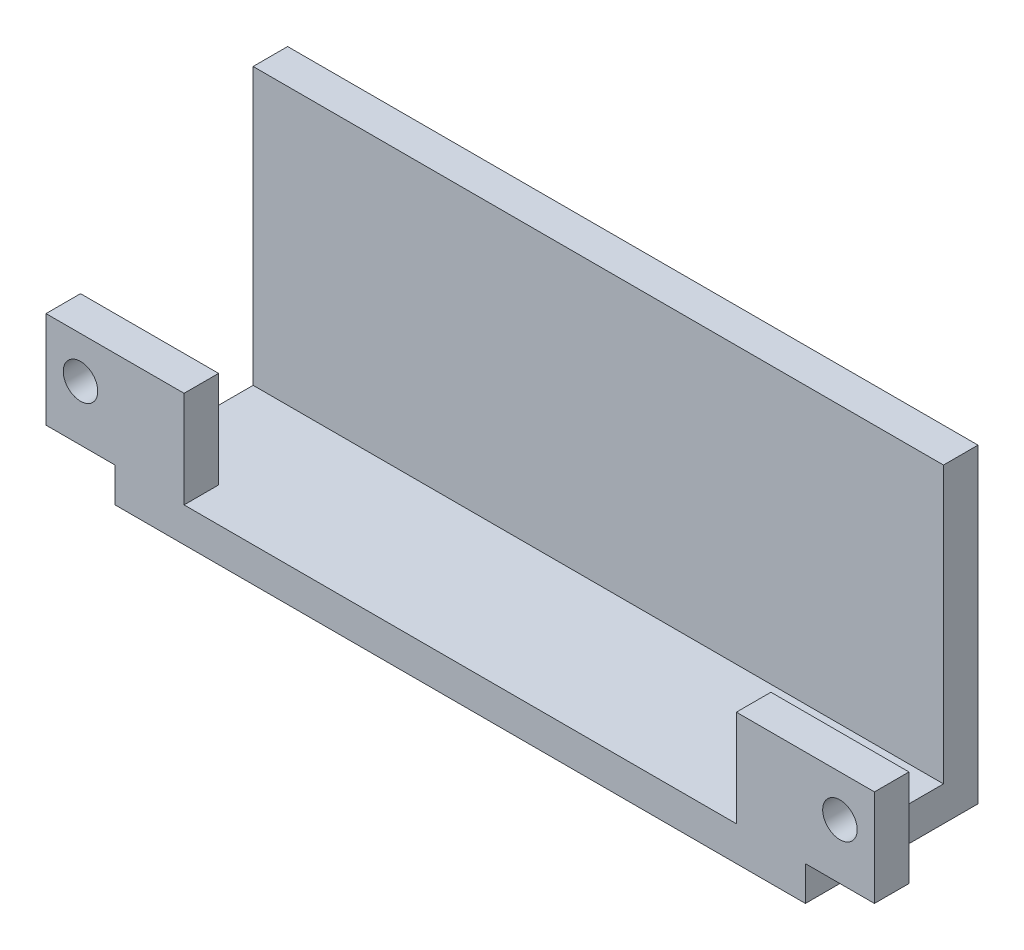
ISO-10303-21;
HEADER;
FILE_DESCRIPTION(('STEP AP214'),'2;1');
FILE_NAME('part.step','',(''),(''),'','','');
FILE_SCHEMA(('AUTOMOTIVE_DESIGN { 1 0 10303 214 1 1 1 1 }'));
ENDSEC;
DATA;
#1=APPLICATION_CONTEXT('core data for automotive mechanical design processes');
#2=APPLICATION_PROTOCOL_DEFINITION('international standard','automotive_design',2000,#1);
#3=PRODUCT_CONTEXT('',#1,'mechanical');
#4=PRODUCT('Part','Part','',(#3));
#5=PRODUCT_RELATED_PRODUCT_CATEGORY('part','',(#4));
#6=PRODUCT_DEFINITION_FORMATION('','',#4);
#7=PRODUCT_DEFINITION_CONTEXT('part definition',#1,'design');
#8=PRODUCT_DEFINITION('design','',#6,#7);
#9=PRODUCT_DEFINITION_SHAPE('','',#8);
#10=(LENGTH_UNIT() NAMED_UNIT(*) SI_UNIT(.MILLI.,.METRE.));
#11=(NAMED_UNIT(*) PLANE_ANGLE_UNIT() SI_UNIT($,.RADIAN.));
#12=(NAMED_UNIT(*) SI_UNIT($,.STERADIAN.) SOLID_ANGLE_UNIT());
#13=UNCERTAINTY_MEASURE_WITH_UNIT(LENGTH_MEASURE(1.E-05),#10,'distance_accuracy_value','');
#14=(GEOMETRIC_REPRESENTATION_CONTEXT(3) GLOBAL_UNCERTAINTY_ASSIGNED_CONTEXT((#13)) GLOBAL_UNIT_ASSIGNED_CONTEXT((#10,
#11,#12)) REPRESENTATION_CONTEXT('',''));
#15=CARTESIAN_POINT('',(0.,0.,0.));
#16=DIRECTION('',(0.,0.,1.));
#17=DIRECTION('',(1.,0.,0.));
#18=AXIS2_PLACEMENT_3D('',#15,#16,#17);
#19=CARTESIAN_POINT('',(0.,6.35,0.));
#20=DIRECTION('',(0.,1.,0.));
#21=DIRECTION('',(0.,0.,1.));
#22=AXIS2_PLACEMENT_3D('',#19,#20,#21);
#23=PLANE('',#22);
#24=DIRECTION('',(0.,0.,-1.));
#25=VECTOR('',#24,1.);
#26=CARTESIAN_POINT('',(63.5,6.35,-15.875));
#27=LINE('',#26,#25);
#28=CARTESIAN_POINT('',(63.5,6.35,9.52499999999999));
#29=VERTEX_POINT('',#28);
#30=CARTESIAN_POINT('',(63.5,6.35,-9.525));
#31=VERTEX_POINT('',#30);
#32=EDGE_CURVE('E52',#29,#31,#27,.T.);
#33=ORIENTED_EDGE('',*,*,#32,.T.);
#34=DIRECTION('',(1.,0.,0.));
#35=VECTOR('',#34,1.);
#36=CARTESIAN_POINT('',(-63.5,6.35,-9.525));
#37=LINE('',#36,#35);
#38=CARTESIAN_POINT('',(-63.5,6.35,-9.525));
#39=VERTEX_POINT('',#38);
#40=EDGE_CURVE('E167',#39,#31,#37,.T.);
#41=ORIENTED_EDGE('',*,*,#40,.F.);
#42=DIRECTION('',(0.,0.,1.));
#43=VECTOR('',#42,1.);
#44=CARTESIAN_POINT('',(-63.5,6.35,-15.875));
#45=LINE('',#44,#43);
#46=CARTESIAN_POINT('',(-63.5,6.35,9.52500000000001));
#47=VERTEX_POINT('',#46);
#48=EDGE_CURVE('E171',#39,#47,#45,.T.);
#49=ORIENTED_EDGE('',*,*,#48,.T.);
#50=DIRECTION('',(-1.,0.,0.));
#51=VECTOR('',#50,1.);
#52=CARTESIAN_POINT('',(-50.8,6.35,9.525));
#53=LINE('',#52,#51);
#54=CARTESIAN_POINT('',(-50.8,6.35,9.525));
#55=VERTEX_POINT('',#54);
#56=EDGE_CURVE('E230',#55,#47,#53,.T.);
#57=ORIENTED_EDGE('',*,*,#56,.F.);
#58=DIRECTION('',(0.,0.,-1.));
#59=VECTOR('',#58,1.);
#60=CARTESIAN_POINT('',(-50.8,6.35,15.875));
#61=LINE('',#60,#59);
#62=CARTESIAN_POINT('',(-50.8,6.35,15.875));
#63=VERTEX_POINT('',#62);
#64=EDGE_CURVE('E215',#63,#55,#61,.T.);
#65=ORIENTED_EDGE('',*,*,#64,.F.);
#66=DIRECTION('',(1.,0.,0.));
#67=VECTOR('',#66,1.);
#68=CARTESIAN_POINT('',(-63.5,6.35,15.875));
#69=LINE('',#68,#67);
#70=CARTESIAN_POINT('',(50.8,6.35,15.875));
#71=VERTEX_POINT('',#70);
#72=EDGE_CURVE('E253',#63,#71,#69,.T.);
#73=ORIENTED_EDGE('',*,*,#72,.T.);
#74=DIRECTION('',(0.,0.,1.));
#75=VECTOR('',#74,1.);
#76=CARTESIAN_POINT('',(50.8,6.35,15.875));
#77=LINE('',#76,#75);
#78=CARTESIAN_POINT('',(50.8,6.35,9.52499999999999));
#79=VERTEX_POINT('',#78);
#80=EDGE_CURVE('E185',#79,#71,#77,.T.);
#81=ORIENTED_EDGE('',*,*,#80,.F.);
#82=DIRECTION('',(1.,0.,0.));
#83=VECTOR('',#82,1.);
#84=CARTESIAN_POINT('',(0.,6.35,9.52499999999999));
#85=LINE('',#84,#83);
#86=EDGE_CURVE('E11',#79,#29,#85,.T.);
#87=ORIENTED_EDGE('',*,*,#86,.T.);
#88=EDGE_LOOP('',(#33,#41,#49,#57,#65,#73,#81,#87));
#89=FACE_BOUND('',#88,.T.);
#90=ADVANCED_FACE('F38',(#89),#23,.T.);
#91=CARTESIAN_POINT('',(63.5,6.35,-15.875));
#92=DIRECTION('',(-1.,0.,0.));
#93=DIRECTION('',(0.,0.,1.));
#94=AXIS2_PLACEMENT_3D('',#91,#92,#93);
#95=PLANE('',#94);
#96=DIRECTION('',(0.,0.,-1.));
#97=VECTOR('',#96,1.);
#98=CARTESIAN_POINT('',(63.5,0.,-15.875));
#99=LINE('',#98,#97);
#100=CARTESIAN_POINT('',(63.5,0.,15.875));
#101=VERTEX_POINT('',#100);
#102=CARTESIAN_POINT('',(63.5,0.,-15.875));
#103=VERTEX_POINT('',#102);
#104=EDGE_CURVE('E248',#101,#103,#99,.T.);
#105=ORIENTED_EDGE('',*,*,#104,.T.);
#106=DIRECTION('',(0.,-1.,0.));
#107=VECTOR('',#106,1.);
#108=CARTESIAN_POINT('',(63.5,6.35,-15.875));
#109=LINE('',#108,#107);
#110=CARTESIAN_POINT('',(63.5,57.15,-15.875));
#111=VERTEX_POINT('',#110);
#112=EDGE_CURVE('E46',#111,#103,#109,.T.);
#113=ORIENTED_EDGE('',*,*,#112,.F.);
#114=DIRECTION('',(0.,0.,-1.));
#115=VECTOR('',#114,1.);
#116=CARTESIAN_POINT('',(63.5,57.15,-15.875));
#117=LINE('',#116,#115);
#118=CARTESIAN_POINT('',(63.5,57.15,-9.525));
#119=VERTEX_POINT('',#118);
#120=EDGE_CURVE('E157',#119,#111,#117,.T.);
#121=ORIENTED_EDGE('',*,*,#120,.F.);
#122=DIRECTION('',(0.,-1.,0.));
#123=VECTOR('',#122,1.);
#124=CARTESIAN_POINT('',(63.5,57.15,-9.525));
#125=LINE('',#124,#123);
#126=EDGE_CURVE('E153',#119,#31,#125,.T.);
#127=ORIENTED_EDGE('',*,*,#126,.T.);
#128=ORIENTED_EDGE('',*,*,#32,.F.);
#129=CARTESIAN_POINT('',(63.5,6.35,15.875));
#130=VERTEX_POINT('',#129);
#131=EDGE_CURVE('E249',#130,#29,#27,.T.);
#132=ORIENTED_EDGE('',*,*,#131,.F.);
#133=DIRECTION('',(0.,-1.,0.));
#134=VECTOR('',#133,1.);
#135=CARTESIAN_POINT('',(63.5,6.35,15.875));
#136=LINE('',#135,#134);
#137=EDGE_CURVE('E256',#130,#101,#136,.T.);
#138=ORIENTED_EDGE('',*,*,#137,.T.);
#139=EDGE_LOOP('',(#105,#113,#121,#127,#128,#132,#138));
#140=FACE_BOUND('',#139,.T.);
#141=ADVANCED_FACE('F40',(#140),#95,.F.);
#142=CARTESIAN_POINT('',(-63.5,6.35,-15.875));
#143=DIRECTION('',(0.,0.,1.));
#144=DIRECTION('',(1.,0.,0.));
#145=AXIS2_PLACEMENT_3D('',#142,#143,#144);
#146=PLANE('',#145);
#147=DIRECTION('',(-1.,0.,0.));
#148=VECTOR('',#147,1.);
#149=CARTESIAN_POINT('',(-63.5,0.,-15.875));
#150=LINE('',#149,#148);
#151=CARTESIAN_POINT('',(-63.5,0.,-15.875));
#152=VERTEX_POINT('',#151);
#153=EDGE_CURVE('E259',#103,#152,#150,.T.);
#154=ORIENTED_EDGE('',*,*,#153,.T.);
#155=DIRECTION('',(0.,-1.,0.));
#156=VECTOR('',#155,1.);
#157=CARTESIAN_POINT('',(-63.5,6.35,-15.875));
#158=LINE('',#157,#156);
#159=CARTESIAN_POINT('',(-63.5,57.15,-15.875));
#160=VERTEX_POINT('',#159);
#161=EDGE_CURVE('E270',#160,#152,#158,.T.);
#162=ORIENTED_EDGE('',*,*,#161,.F.);
#163=DIRECTION('',(-1.,0.,0.));
#164=VECTOR('',#163,1.);
#165=CARTESIAN_POINT('',(-63.5,57.15,-15.875));
#166=LINE('',#165,#164);
#167=EDGE_CURVE('E164',#111,#160,#166,.T.);
#168=ORIENTED_EDGE('',*,*,#167,.F.);
#169=ORIENTED_EDGE('',*,*,#112,.T.);
#170=EDGE_LOOP('',(#154,#162,#168,#169));
#171=FACE_BOUND('',#170,.T.);
#172=ADVANCED_FACE('F273',(#171),#146,.F.);
#173=CARTESIAN_POINT('',(-63.5,6.35,-15.875));
#174=DIRECTION('',(1.,0.,0.));
#175=DIRECTION('',(0.,0.,-1.));
#176=AXIS2_PLACEMENT_3D('',#173,#174,#175);
#177=PLANE('',#176);
#178=DIRECTION('',(0.,0.,1.));
#179=VECTOR('',#178,1.);
#180=CARTESIAN_POINT('',(-63.5,0.,-15.875));
#181=LINE('',#180,#179);
#182=CARTESIAN_POINT('',(-63.5,0.,15.875));
#183=VERTEX_POINT('',#182);
#184=EDGE_CURVE('E261',#152,#183,#181,.T.);
#185=ORIENTED_EDGE('',*,*,#184,.T.);
#186=DIRECTION('',(0.,-1.,0.));
#187=VECTOR('',#186,1.);
#188=CARTESIAN_POINT('',(-63.5,6.35,15.875));
#189=LINE('',#188,#187);
#190=CARTESIAN_POINT('',(-63.5,6.35,15.875));
#191=VERTEX_POINT('',#190);
#192=EDGE_CURVE('E267',#191,#183,#189,.T.);
#193=ORIENTED_EDGE('',*,*,#192,.F.);
#194=EDGE_CURVE('E251',#47,#191,#45,.T.);
#195=ORIENTED_EDGE('',*,*,#194,.F.);
#196=ORIENTED_EDGE('',*,*,#48,.F.);
#197=DIRECTION('',(0.,-1.,0.));
#198=VECTOR('',#197,1.);
#199=CARTESIAN_POINT('',(-63.5,57.15,-9.525));
#200=LINE('',#199,#198);
#201=CARTESIAN_POINT('',(-63.5,57.15,-9.525));
#202=VERTEX_POINT('',#201);
#203=EDGE_CURVE('E151',#202,#39,#200,.T.);
#204=ORIENTED_EDGE('',*,*,#203,.F.);
#205=DIRECTION('',(0.,0.,1.));
#206=VECTOR('',#205,1.);
#207=CARTESIAN_POINT('',(-63.5,57.15,-15.875));
#208=LINE('',#207,#206);
#209=EDGE_CURVE('E158',#160,#202,#208,.T.);
#210=ORIENTED_EDGE('',*,*,#209,.F.);
#211=ORIENTED_EDGE('',*,*,#161,.T.);
#212=EDGE_LOOP('',(#185,#193,#195,#196,#204,#210,#211));
#213=FACE_BOUND('',#212,.T.);
#214=ADVANCED_FACE('F169',(#213),#177,.F.);
#215=CARTESIAN_POINT('',(-63.5,6.35,15.875));
#216=DIRECTION('',(0.,0.,-1.));
#217=DIRECTION('',(-1.,0.,0.));
#218=AXIS2_PLACEMENT_3D('',#215,#216,#217);
#219=PLANE('',#218);
#220=CARTESIAN_POINT('',(-69.85,16.51,15.875));
#221=DIRECTION('',(0.,0.,-1.));
#222=DIRECTION('',(-1.,0.,0.));
#223=AXIS2_PLACEMENT_3D('',#220,#221,#222);
#224=CIRCLE('',#223,3.175);
#225=CARTESIAN_POINT('',(-73.025,16.51,15.875));
#226=VERTEX_POINT('',#225);
#227=EDGE_CURVE('E183',#226,#226,#224,.F.);
#228=ORIENTED_EDGE('',*,*,#227,.F.);
#229=EDGE_LOOP('',(#228));
#230=FACE_BOUND('',#229,.T.);
#231=CARTESIAN_POINT('',(69.85,16.51,15.875));
#232=DIRECTION('',(0.,0.,-1.));
#233=DIRECTION('',(-1.,0.,0.));
#234=AXIS2_PLACEMENT_3D('',#231,#232,#233);
#235=CIRCLE('',#234,3.175);
#236=CARTESIAN_POINT('',(66.675,16.51,15.875));
#237=VERTEX_POINT('',#236);
#238=EDGE_CURVE('E175',#237,#237,#235,.F.);
#239=ORIENTED_EDGE('',*,*,#238,.F.);
#240=EDGE_LOOP('',(#239));
#241=FACE_BOUND('',#240,.T.);
#242=DIRECTION('',(1.,0.,0.));
#243=VECTOR('',#242,1.);
#244=CARTESIAN_POINT('',(-63.5,0.,15.875));
#245=LINE('',#244,#243);
#246=EDGE_CURVE('E263',#183,#101,#245,.T.);
#247=ORIENTED_EDGE('',*,*,#246,.T.);
#248=ORIENTED_EDGE('',*,*,#137,.F.);
#249=DIRECTION('',(1.,0.,0.));
#250=VECTOR('',#249,1.);
#251=CARTESIAN_POINT('',(50.8,6.35,15.875));
#252=LINE('',#251,#250);
#253=CARTESIAN_POINT('',(76.2,6.35,15.875));
#254=VERTEX_POINT('',#253);
#255=EDGE_CURVE('E201',#130,#254,#252,.T.);
#256=ORIENTED_EDGE('',*,*,#255,.T.);
#257=DIRECTION('',(0.,-1.,0.));
#258=VECTOR('',#257,1.);
#259=CARTESIAN_POINT('',(76.2,24.13,15.875));
#260=LINE('',#259,#258);
#261=CARTESIAN_POINT('',(76.2,24.13,15.875));
#262=VERTEX_POINT('',#261);
#263=EDGE_CURVE('E210',#262,#254,#260,.T.);
#264=ORIENTED_EDGE('',*,*,#263,.F.);
#265=DIRECTION('',(1.,0.,0.));
#266=VECTOR('',#265,1.);
#267=CARTESIAN_POINT('',(50.8,24.13,15.875));
#268=LINE('',#267,#266);
#269=CARTESIAN_POINT('',(50.8,24.13,15.875));
#270=VERTEX_POINT('',#269);
#271=EDGE_CURVE('E192',#270,#262,#268,.T.);
#272=ORIENTED_EDGE('',*,*,#271,.F.);
#273=DIRECTION('',(0.,-1.,0.));
#274=VECTOR('',#273,1.);
#275=CARTESIAN_POINT('',(50.8,24.13,15.875));
#276=LINE('',#275,#274);
#277=EDGE_CURVE('E213',#270,#71,#276,.T.);
#278=ORIENTED_EDGE('',*,*,#277,.T.);
#279=ORIENTED_EDGE('',*,*,#72,.F.);
#280=DIRECTION('',(0.,-1.,0.));
#281=VECTOR('',#280,1.);
#282=CARTESIAN_POINT('',(-50.8,24.13,15.875));
#283=LINE('',#282,#281);
#284=CARTESIAN_POINT('',(-50.8,24.13,15.875));
#285=VERTEX_POINT('',#284);
#286=EDGE_CURVE('E226',#285,#63,#283,.T.);
#287=ORIENTED_EDGE('',*,*,#286,.F.);
#288=DIRECTION('',(1.,0.,0.));
#289=VECTOR('',#288,1.);
#290=CARTESIAN_POINT('',(-50.8,24.13,15.875));
#291=LINE('',#290,#289);
#292=CARTESIAN_POINT('',(-76.2,24.13,15.875));
#293=VERTEX_POINT('',#292);
#294=EDGE_CURVE('E224',#293,#285,#291,.T.);
#295=ORIENTED_EDGE('',*,*,#294,.F.);
#296=DIRECTION('',(0.,-1.,0.));
#297=VECTOR('',#296,1.);
#298=CARTESIAN_POINT('',(-76.2,24.13,15.875));
#299=LINE('',#298,#297);
#300=CARTESIAN_POINT('',(-76.2,6.35,15.875));
#301=VERTEX_POINT('',#300);
#302=EDGE_CURVE('E239',#293,#301,#299,.T.);
#303=ORIENTED_EDGE('',*,*,#302,.T.);
#304=DIRECTION('',(1.,0.,0.));
#305=VECTOR('',#304,1.);
#306=CARTESIAN_POINT('',(-50.8,6.35,15.875));
#307=LINE('',#306,#305);
#308=EDGE_CURVE('E220',#301,#191,#307,.T.);
#309=ORIENTED_EDGE('',*,*,#308,.T.);
#310=ORIENTED_EDGE('',*,*,#192,.T.);
#311=EDGE_LOOP('',(#247,#248,#256,#264,#272,#278,#279,#287,#295,#303,#309,#310));
#312=FACE_BOUND('',#311,.T.);
#313=ADVANCED_FACE('F284',(#230,#241,#312),#219,.F.);
#314=CARTESIAN_POINT('',(0.,0.,0.));
#315=DIRECTION('',(0.,1.,0.));
#316=DIRECTION('',(0.,0.,1.));
#317=AXIS2_PLACEMENT_3D('',#314,#315,#316);
#318=PLANE('',#317);
#319=ORIENTED_EDGE('',*,*,#104,.F.);
#320=ORIENTED_EDGE('',*,*,#246,.F.);
#321=ORIENTED_EDGE('',*,*,#184,.F.);
#322=ORIENTED_EDGE('',*,*,#153,.F.);
#323=EDGE_LOOP('',(#319,#320,#321,#322));
#324=FACE_BOUND('',#323,.T.);
#325=ADVANCED_FACE('F280',(#324),#318,.F.);
#326=CARTESIAN_POINT('',(0.,6.35,0.));
#327=DIRECTION('',(0.,1.,0.));
#328=DIRECTION('',(0.,0.,1.));
#329=AXIS2_PLACEMENT_3D('',#326,#327,#328);
#330=PLANE('',#329);
#331=CARTESIAN_POINT('',(-76.2,6.35,9.52500000000001));
#332=VERTEX_POINT('',#331);
#333=EDGE_CURVE('E229',#47,#332,#53,.T.);
#334=ORIENTED_EDGE('',*,*,#333,.F.);
#335=ORIENTED_EDGE('',*,*,#194,.T.);
#336=ORIENTED_EDGE('',*,*,#308,.F.);
#337=DIRECTION('',(0.,0.,1.));
#338=VECTOR('',#337,1.);
#339=CARTESIAN_POINT('',(-76.2,6.35,15.875));
#340=LINE('',#339,#338);
#341=EDGE_CURVE('E233',#332,#301,#340,.T.);
#342=ORIENTED_EDGE('',*,*,#341,.F.);
#343=EDGE_LOOP('',(#334,#335,#336,#342));
#344=FACE_BOUND('',#343,.T.);
#345=ADVANCED_FACE('F291',(#344),#330,.F.);
#346=CARTESIAN_POINT('',(-50.8,24.13,15.875));
#347=DIRECTION('',(-1.,0.,0.));
#348=DIRECTION('',(0.,0.,1.));
#349=AXIS2_PLACEMENT_3D('',#346,#347,#348);
#350=PLANE('',#349);
#351=ORIENTED_EDGE('',*,*,#64,.T.);
#352=DIRECTION('',(0.,-1.,0.));
#353=VECTOR('',#352,1.);
#354=CARTESIAN_POINT('',(-50.8,24.13,9.525));
#355=LINE('',#354,#353);
#356=CARTESIAN_POINT('',(-50.8,24.13,9.525));
#357=VERTEX_POINT('',#356);
#358=EDGE_CURVE('E245',#357,#55,#355,.T.);
#359=ORIENTED_EDGE('',*,*,#358,.F.);
#360=DIRECTION('',(0.,0.,-1.));
#361=VECTOR('',#360,1.);
#362=CARTESIAN_POINT('',(-50.8,24.13,15.875));
#363=LINE('',#362,#361);
#364=EDGE_CURVE('E216',#285,#357,#363,.T.);
#365=ORIENTED_EDGE('',*,*,#364,.F.);
#366=ORIENTED_EDGE('',*,*,#286,.T.);
#367=EDGE_LOOP('',(#351,#359,#365,#366));
#368=FACE_BOUND('',#367,.T.);
#369=ADVANCED_FACE('F320',(#368),#350,.F.);
#370=CARTESIAN_POINT('',(-50.8,24.13,9.525));
#371=DIRECTION('',(0.,0.,1.));
#372=DIRECTION('',(1.,0.,0.));
#373=AXIS2_PLACEMENT_3D('',#370,#371,#372);
#374=PLANE('',#373);
#375=CARTESIAN_POINT('',(-69.85,16.51,9.52499999999999));
#376=DIRECTION('',(0.,0.,-1.));
#377=DIRECTION('',(-1.,0.,0.));
#378=AXIS2_PLACEMENT_3D('',#375,#376,#377);
#379=CIRCLE('',#378,3.175);
#380=CARTESIAN_POINT('',(-73.025,16.51,9.52499999999999));
#381=VERTEX_POINT('',#380);
#382=EDGE_CURVE('E180',#381,#381,#379,.T.);
#383=ORIENTED_EDGE('',*,*,#382,.F.);
#384=EDGE_LOOP('',(#383));
#385=FACE_BOUND('',#384,.T.);
#386=ORIENTED_EDGE('',*,*,#56,.T.);
#387=ORIENTED_EDGE('',*,*,#333,.T.);
#388=DIRECTION('',(0.,-1.,0.));
#389=VECTOR('',#388,1.);
#390=CARTESIAN_POINT('',(-76.2,24.13,9.52500000000001));
#391=LINE('',#390,#389);
#392=CARTESIAN_POINT('',(-76.2,24.13,9.52500000000001));
#393=VERTEX_POINT('',#392);
#394=EDGE_CURVE('E242',#393,#332,#391,.T.);
#395=ORIENTED_EDGE('',*,*,#394,.F.);
#396=DIRECTION('',(-1.,0.,0.));
#397=VECTOR('',#396,1.);
#398=CARTESIAN_POINT('',(-50.8,24.13,9.525));
#399=LINE('',#398,#397);
#400=EDGE_CURVE('E219',#357,#393,#399,.T.);
#401=ORIENTED_EDGE('',*,*,#400,.F.);
#402=ORIENTED_EDGE('',*,*,#358,.T.);
#403=EDGE_LOOP('',(#386,#387,#395,#401,#402));
#404=FACE_BOUND('',#403,.T.);
#405=ADVANCED_FACE('F294',(#385,#404),#374,.F.);
#406=CARTESIAN_POINT('',(-76.2,24.13,15.875));
#407=DIRECTION('',(1.,0.,0.));
#408=DIRECTION('',(0.,0.,-1.));
#409=AXIS2_PLACEMENT_3D('',#406,#407,#408);
#410=PLANE('',#409);
#411=ORIENTED_EDGE('',*,*,#341,.T.);
#412=ORIENTED_EDGE('',*,*,#302,.F.);
#413=DIRECTION('',(0.,0.,1.));
#414=VECTOR('',#413,1.);
#415=CARTESIAN_POINT('',(-76.2,24.13,15.875));
#416=LINE('',#415,#414);
#417=EDGE_CURVE('E222',#393,#293,#416,.T.);
#418=ORIENTED_EDGE('',*,*,#417,.F.);
#419=ORIENTED_EDGE('',*,*,#394,.T.);
#420=EDGE_LOOP('',(#411,#412,#418,#419));
#421=FACE_BOUND('',#420,.T.);
#422=ADVANCED_FACE('F325',(#421),#410,.F.);
#423=CARTESIAN_POINT('',(0.,24.13,0.));
#424=DIRECTION('',(0.,1.,0.));
#425=DIRECTION('',(0.,0.,1.));
#426=AXIS2_PLACEMENT_3D('',#423,#424,#425);
#427=PLANE('',#426);
#428=ORIENTED_EDGE('',*,*,#364,.T.);
#429=ORIENTED_EDGE('',*,*,#400,.T.);
#430=ORIENTED_EDGE('',*,*,#417,.T.);
#431=ORIENTED_EDGE('',*,*,#294,.T.);
#432=EDGE_LOOP('',(#428,#429,#430,#431));
#433=FACE_BOUND('',#432,.T.);
#434=ADVANCED_FACE('F322',(#433),#427,.T.);
#435=CARTESIAN_POINT('',(0.,6.35,0.));
#436=DIRECTION('',(0.,-1.,0.));
#437=DIRECTION('',(0.,0.,-1.));
#438=AXIS2_PLACEMENT_3D('',#435,#436,#437);
#439=PLANE('',#438);
#440=ORIENTED_EDGE('',*,*,#131,.T.);
#441=DIRECTION('',(-1.,0.,0.));
#442=VECTOR('',#441,1.);
#443=CARTESIAN_POINT('',(50.8,6.35,9.52499999999999));
#444=LINE('',#443,#442);
#445=CARTESIAN_POINT('',(76.2,6.35,9.52499999999999));
#446=VERTEX_POINT('',#445);
#447=EDGE_CURVE('E60',#446,#29,#444,.T.);
#448=ORIENTED_EDGE('',*,*,#447,.F.);
#449=DIRECTION('',(0.,0.,-1.));
#450=VECTOR('',#449,1.);
#451=CARTESIAN_POINT('',(76.2,6.35,15.875));
#452=LINE('',#451,#450);
#453=EDGE_CURVE('E203',#254,#446,#452,.T.);
#454=ORIENTED_EDGE('',*,*,#453,.F.);
#455=ORIENTED_EDGE('',*,*,#255,.F.);
#456=EDGE_LOOP('',(#440,#448,#454,#455));
#457=FACE_BOUND('',#456,.T.);
#458=ADVANCED_FACE('F300',(#457),#439,.T.);
#459=CARTESIAN_POINT('',(50.8,24.13,15.875));
#460=DIRECTION('',(1.,0.,0.));
#461=DIRECTION('',(0.,0.,-1.));
#462=AXIS2_PLACEMENT_3D('',#459,#460,#461);
#463=PLANE('',#462);
#464=ORIENTED_EDGE('',*,*,#80,.T.);
#465=ORIENTED_EDGE('',*,*,#277,.F.);
#466=DIRECTION('',(0.,0.,1.));
#467=VECTOR('',#466,1.);
#468=CARTESIAN_POINT('',(50.8,24.13,15.875));
#469=LINE('',#468,#467);
#470=CARTESIAN_POINT('',(50.8,24.13,9.52499999999999));
#471=VERTEX_POINT('',#470);
#472=EDGE_CURVE('E189',#471,#270,#469,.T.);
#473=ORIENTED_EDGE('',*,*,#472,.F.);
#474=DIRECTION('',(0.,-1.,0.));
#475=VECTOR('',#474,1.);
#476=CARTESIAN_POINT('',(50.8,24.13,9.52499999999999));
#477=LINE('',#476,#475);
#478=EDGE_CURVE('E198',#471,#79,#477,.T.);
#479=ORIENTED_EDGE('',*,*,#478,.T.);
#480=EDGE_LOOP('',(#464,#465,#473,#479));
#481=FACE_BOUND('',#480,.T.);
#482=ADVANCED_FACE('F308',(#481),#463,.F.);
#483=CARTESIAN_POINT('',(76.2,24.13,15.875));
#484=DIRECTION('',(-1.,0.,0.));
#485=DIRECTION('',(0.,0.,1.));
#486=AXIS2_PLACEMENT_3D('',#483,#484,#485);
#487=PLANE('',#486);
#488=ORIENTED_EDGE('',*,*,#453,.T.);
#489=DIRECTION('',(0.,-1.,0.));
#490=VECTOR('',#489,1.);
#491=CARTESIAN_POINT('',(76.2,24.13,9.52499999999999));
#492=LINE('',#491,#490);
#493=CARTESIAN_POINT('',(76.2,24.13,9.52499999999999));
#494=VERTEX_POINT('',#493);
#495=EDGE_CURVE('E208',#494,#446,#492,.T.);
#496=ORIENTED_EDGE('',*,*,#495,.F.);
#497=DIRECTION('',(0.,0.,-1.));
#498=VECTOR('',#497,1.);
#499=CARTESIAN_POINT('',(76.2,24.13,15.875));
#500=LINE('',#499,#498);
#501=EDGE_CURVE('E194',#262,#494,#500,.T.);
#502=ORIENTED_EDGE('',*,*,#501,.F.);
#503=ORIENTED_EDGE('',*,*,#263,.T.);
#504=EDGE_LOOP('',(#488,#496,#502,#503));
#505=FACE_BOUND('',#504,.T.);
#506=ADVANCED_FACE('F316',(#505),#487,.F.);
#507=CARTESIAN_POINT('',(50.8,24.13,9.52499999999999));
#508=DIRECTION('',(0.,0.,1.));
#509=DIRECTION('',(1.,0.,0.));
#510=AXIS2_PLACEMENT_3D('',#507,#508,#509);
#511=PLANE('',#510);
#512=CARTESIAN_POINT('',(69.85,16.51,9.52499999999999));
#513=DIRECTION('',(0.,0.,-1.));
#514=DIRECTION('',(-1.,0.,0.));
#515=AXIS2_PLACEMENT_3D('',#512,#513,#514);
#516=CIRCLE('',#515,3.175);
#517=CARTESIAN_POINT('',(66.675,16.51,9.52499999999999));
#518=VERTEX_POINT('',#517);
#519=EDGE_CURVE('E172',#518,#518,#516,.T.);
#520=ORIENTED_EDGE('',*,*,#519,.F.);
#521=EDGE_LOOP('',(#520));
#522=FACE_BOUND('',#521,.T.);
#523=ORIENTED_EDGE('',*,*,#447,.T.);
#524=ORIENTED_EDGE('',*,*,#86,.F.);
#525=ORIENTED_EDGE('',*,*,#478,.F.);
#526=DIRECTION('',(-1.,0.,0.));
#527=VECTOR('',#526,1.);
#528=CARTESIAN_POINT('',(50.8,24.13,9.52499999999999));
#529=LINE('',#528,#527);
#530=EDGE_CURVE('E196',#494,#471,#529,.T.);
#531=ORIENTED_EDGE('',*,*,#530,.F.);
#532=ORIENTED_EDGE('',*,*,#495,.T.);
#533=EDGE_LOOP('',(#523,#524,#525,#531,#532));
#534=FACE_BOUND('',#533,.T.);
#535=ADVANCED_FACE('F304',(#522,#534),#511,.F.);
#536=CARTESIAN_POINT('',(0.,24.13,0.));
#537=DIRECTION('',(0.,-1.,0.));
#538=DIRECTION('',(0.,0.,-1.));
#539=AXIS2_PLACEMENT_3D('',#536,#537,#538);
#540=PLANE('',#539);
#541=ORIENTED_EDGE('',*,*,#472,.T.);
#542=ORIENTED_EDGE('',*,*,#271,.T.);
#543=ORIENTED_EDGE('',*,*,#501,.T.);
#544=ORIENTED_EDGE('',*,*,#530,.T.);
#545=EDGE_LOOP('',(#541,#542,#543,#544));
#546=FACE_BOUND('',#545,.T.);
#547=ADVANCED_FACE('F311',(#546),#540,.F.);
#548=CARTESIAN_POINT('',(69.85,16.51,24.8552561210692));
#549=DIRECTION('',(0.,0.,-1.));
#550=DIRECTION('',(-1.,0.,0.));
#551=AXIS2_PLACEMENT_3D('',#548,#549,#550);
#552=CYLINDRICAL_SURFACE('',#551,3.175);
#553=ORIENTED_EDGE('',*,*,#238,.T.);
#554=EDGE_LOOP('',(#553));
#555=FACE_BOUND('',#554,.T.);
#556=ORIENTED_EDGE('',*,*,#519,.T.);
#557=EDGE_LOOP('',(#556));
#558=FACE_BOUND('',#557,.T.);
#559=ADVANCED_FACE('F401',(#555,#558),#552,.F.);
#560=CARTESIAN_POINT('',(-69.85,16.51,24.8552561210692));
#561=DIRECTION('',(0.,0.,-1.));
#562=DIRECTION('',(-1.,0.,0.));
#563=AXIS2_PLACEMENT_3D('',#560,#561,#562);
#564=CYLINDRICAL_SURFACE('',#563,3.175);
#565=ORIENTED_EDGE('',*,*,#227,.T.);
#566=EDGE_LOOP('',(#565));
#567=FACE_BOUND('',#566,.T.);
#568=ORIENTED_EDGE('',*,*,#382,.T.);
#569=EDGE_LOOP('',(#568));
#570=FACE_BOUND('',#569,.T.);
#571=ADVANCED_FACE('F406',(#567,#570),#564,.F.);
#572=CARTESIAN_POINT('',(-63.5,57.15,-9.525));
#573=DIRECTION('',(0.,0.,-1.));
#574=DIRECTION('',(-1.,0.,0.));
#575=AXIS2_PLACEMENT_3D('',#572,#573,#574);
#576=PLANE('',#575);
#577=ORIENTED_EDGE('',*,*,#40,.T.);
#578=ORIENTED_EDGE('',*,*,#126,.F.);
#579=DIRECTION('',(1.,0.,0.));
#580=VECTOR('',#579,1.);
#581=CARTESIAN_POINT('',(-63.5,57.15,-9.525));
#582=LINE('',#581,#580);
#583=EDGE_CURVE('E147',#202,#119,#582,.T.);
#584=ORIENTED_EDGE('',*,*,#583,.F.);
#585=ORIENTED_EDGE('',*,*,#203,.T.);
#586=EDGE_LOOP('',(#577,#578,#584,#585));
#587=FACE_BOUND('',#586,.T.);
#588=ADVANCED_FACE('F149',(#587),#576,.F.);
#589=CARTESIAN_POINT('',(0.,57.15,0.));
#590=DIRECTION('',(0.,1.,0.));
#591=DIRECTION('',(0.,0.,1.));
#592=AXIS2_PLACEMENT_3D('',#589,#590,#591);
#593=PLANE('',#592);
#594=ORIENTED_EDGE('',*,*,#209,.T.);
#595=ORIENTED_EDGE('',*,*,#583,.T.);
#596=ORIENTED_EDGE('',*,*,#120,.T.);
#597=ORIENTED_EDGE('',*,*,#167,.T.);
#598=EDGE_LOOP('',(#594,#595,#596,#597));
#599=FACE_BOUND('',#598,.T.);
#600=ADVANCED_FACE('F162',(#599),#593,.T.);
#601=CLOSED_SHELL('',(#90,#141,#172,#214,#313,#325,#345,#369,#405,#422,#434,#458,#482,#506,#535,
#547,#559,#571,#588,#600));
#602=MANIFOLD_SOLID_BREP('B2',#601);
#603=ADVANCED_BREP_SHAPE_REPRESENTATION('',(#18,#602),#14);
#604=SHAPE_DEFINITION_REPRESENTATION(#9,#603);
ENDSEC;
END-ISO-10303-21;
